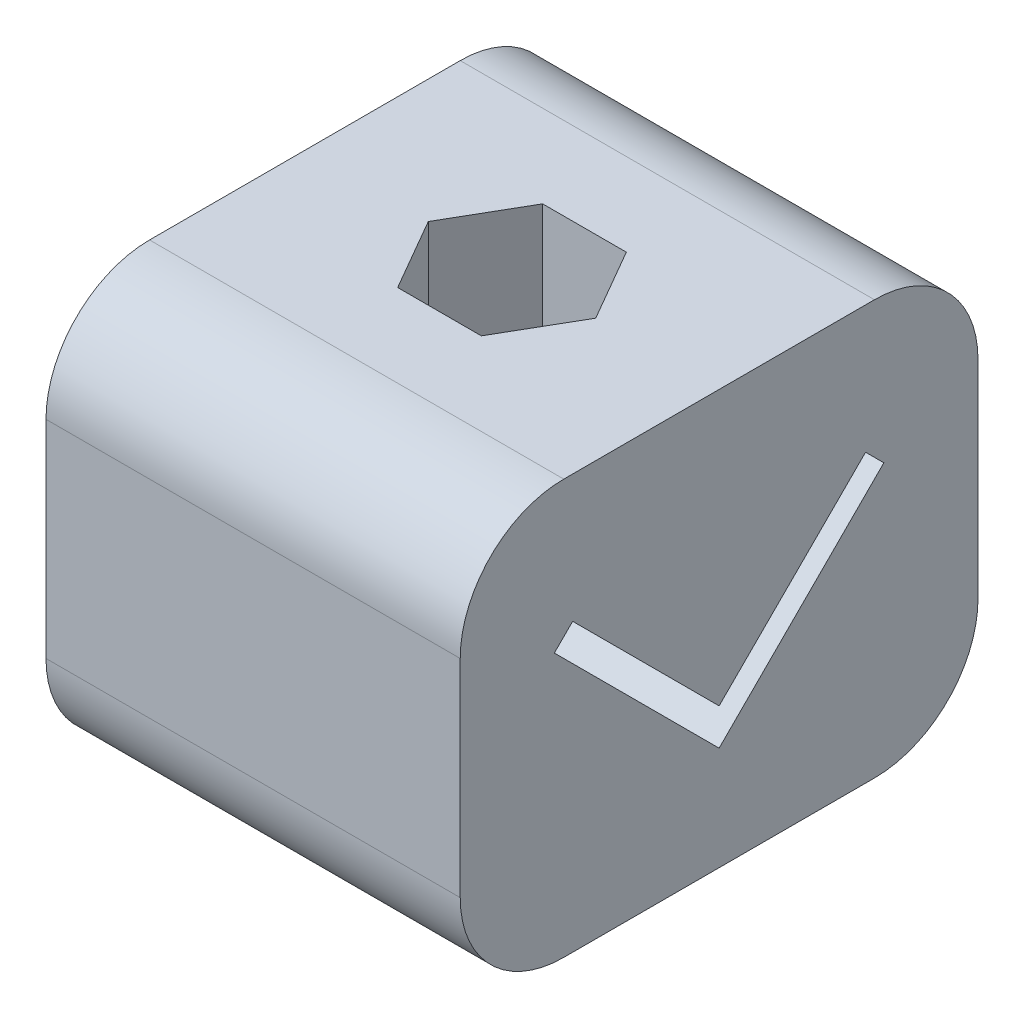
ISO-10303-21;
HEADER;
FILE_DESCRIPTION(('STEP AP214'),'2;1');
FILE_NAME('part.step','',(''),(''),'','','');
FILE_SCHEMA(('AUTOMOTIVE_DESIGN { 1 0 10303 214 1 1 1 1 }'));
ENDSEC;
DATA;
#1=APPLICATION_CONTEXT('core data for automotive mechanical design processes');
#2=APPLICATION_PROTOCOL_DEFINITION('international standard','automotive_design',2000,#1);
#3=PRODUCT_CONTEXT('',#1,'mechanical');
#4=PRODUCT('Part','Part','',(#3));
#5=PRODUCT_RELATED_PRODUCT_CATEGORY('part','',(#4));
#6=PRODUCT_DEFINITION_FORMATION('','',#4);
#7=PRODUCT_DEFINITION_CONTEXT('part definition',#1,'design');
#8=PRODUCT_DEFINITION('design','',#6,#7);
#9=PRODUCT_DEFINITION_SHAPE('','',#8);
#10=(LENGTH_UNIT() NAMED_UNIT(*) SI_UNIT(.MILLI.,.METRE.));
#11=(NAMED_UNIT(*) PLANE_ANGLE_UNIT() SI_UNIT($,.RADIAN.));
#12=(NAMED_UNIT(*) SI_UNIT($,.STERADIAN.) SOLID_ANGLE_UNIT());
#13=UNCERTAINTY_MEASURE_WITH_UNIT(LENGTH_MEASURE(1.E-05),#10,'distance_accuracy_value','');
#14=(GEOMETRIC_REPRESENTATION_CONTEXT(3) GLOBAL_UNCERTAINTY_ASSIGNED_CONTEXT((#13)) GLOBAL_UNIT_ASSIGNED_CONTEXT((#10,
#11,#12)) REPRESENTATION_CONTEXT('',''));
#15=CARTESIAN_POINT('',(0.,0.,0.));
#16=DIRECTION('',(0.,0.,1.));
#17=DIRECTION('',(1.,0.,0.));
#18=AXIS2_PLACEMENT_3D('',#15,#16,#17);
#19=CARTESIAN_POINT('',(0.,25.4,0.));
#20=DIRECTION('',(0.,1.,0.));
#21=DIRECTION('',(0.,0.,1.));
#22=AXIS2_PLACEMENT_3D('',#19,#20,#21);
#23=CYLINDRICAL_SURFACE('',#22,1.984375);
#24=CARTESIAN_POINT('',(0.,6.35,0.));
#25=DIRECTION('',(0.,-0.707106781186548,-0.707106781186547));
#26=DIRECTION('',(0.,0.707106781186547,-0.707106781186548));
#27=AXIS2_PLACEMENT_3D('',#24,#25,#26);
#28=ELLIPSE('',#27,2.8063300378341,1.984375);
#29=CARTESIAN_POINT('',(-1.98437499999993,6.35,0.));
#30=VERTEX_POINT('',#29);
#31=CARTESIAN_POINT('',(1.98437500000009,6.35,0.));
#32=VERTEX_POINT('',#31);
#33=EDGE_CURVE('E276',#30,#32,#28,.T.);
#34=ORIENTED_EDGE('',*,*,#33,.F.);
#35=CARTESIAN_POINT('',(0.,6.35,0.));
#36=DIRECTION('',(0.,-0.707106781186548,0.707106781186547));
#37=DIRECTION('',(0.,0.707106781186547,0.707106781186548));
#38=AXIS2_PLACEMENT_3D('',#35,#36,#37);
#39=ELLIPSE('',#38,2.8063300378341,1.984375);
#40=EDGE_CURVE('E280',#32,#30,#39,.T.);
#41=ORIENTED_EDGE('',*,*,#40,.F.);
#42=EDGE_LOOP('',(#34,#41));
#43=FACE_BOUND('',#42,.T.);
#44=CARTESIAN_POINT('',(0.,5.08,0.));
#45=DIRECTION('',(0.,-1.,0.));
#46=DIRECTION('',(0.,0.,-1.));
#47=AXIS2_PLACEMENT_3D('',#44,#45,#46);
#48=CIRCLE('',#47,1.984375);
#49=CARTESIAN_POINT('',(0.,5.08,-1.984375));
#50=VERTEX_POINT('',#49);
#51=EDGE_CURVE('E243',#50,#50,#48,.F.);
#52=ORIENTED_EDGE('',*,*,#51,.F.);
#53=EDGE_LOOP('',(#52));
#54=FACE_BOUND('',#53,.T.);
#55=ADVANCED_FACE('F39',(#43,#54),#23,.F.);
#56=CARTESIAN_POINT('',(0.,8.59506403026729,0.));
#57=DIRECTION('',(0.,0.707106781186548,0.707106781186548));
#58=DIRECTION('',(0.,0.707106781186548,-0.707106781186548));
#59=AXIS2_PLACEMENT_3D('',#56,#57,#58);
#60=ELLIPSE('',#59,2.80633003783411,1.984375);
#61=CARTESIAN_POINT('',(1.98437500000007,8.59506403026729,0.));
#62=VERTEX_POINT('',#61);
#63=CARTESIAN_POINT('',(-1.9843749999999,8.59506403026729,0.));
#64=VERTEX_POINT('',#63);
#65=EDGE_CURVE('E385',#62,#64,#60,.T.);
#66=ORIENTED_EDGE('',*,*,#65,.F.);
#67=CARTESIAN_POINT('',(0.,8.59506403026729,0.));
#68=DIRECTION('',(0.,0.707106781186548,-0.707106781186548));
#69=DIRECTION('',(0.,0.707106781186548,0.707106781186548));
#70=AXIS2_PLACEMENT_3D('',#67,#68,#69);
#71=ELLIPSE('',#70,2.80633003783411,1.984375);
#72=EDGE_CURVE('E272',#64,#62,#71,.T.);
#73=ORIENTED_EDGE('',*,*,#72,.F.);
#74=EDGE_LOOP('',(#66,#73));
#75=FACE_BOUND('',#74,.T.);
#76=CARTESIAN_POINT('',(0.,13.97,0.));
#77=DIRECTION('',(0.,1.,0.));
#78=DIRECTION('',(0.,0.,1.));
#79=AXIS2_PLACEMENT_3D('',#76,#77,#78);
#80=CIRCLE('',#79,1.984375);
#81=CARTESIAN_POINT('',(0.,13.97,1.984375));
#82=VERTEX_POINT('',#81);
#83=EDGE_CURVE('E260',#82,#82,#80,.F.);
#84=ORIENTED_EDGE('',*,*,#83,.F.);
#85=EDGE_LOOP('',(#84));
#86=FACE_BOUND('',#85,.T.);
#87=ADVANCED_FACE('F479',(#75,#86),#23,.F.);
#88=CARTESIAN_POINT('',(0.,0.,15.875));
#89=DIRECTION('',(0.,1.,0.));
#90=DIRECTION('',(0.,0.,1.));
#91=AXIS2_PLACEMENT_3D('',#88,#89,#90);
#92=PLANE('',#91);
#93=CARTESIAN_POINT('',(0.,0.,0.));
#94=DIRECTION('',(0.,-1.,0.));
#95=DIRECTION('',(0.,0.,-1.));
#96=AXIS2_PLACEMENT_3D('',#93,#94,#95);
#97=CIRCLE('',#96,4.1275);
#98=CARTESIAN_POINT('',(0.,0.,-4.1275));
#99=VERTEX_POINT('',#98);
#100=EDGE_CURVE('E226',#99,#99,#97,.T.);
#101=ORIENTED_EDGE('',*,*,#100,.F.);
#102=EDGE_LOOP('',(#101));
#103=FACE_BOUND('',#102,.T.);
#104=DIRECTION('',(0.,0.,-1.));
#105=VECTOR('',#104,1.);
#106=CARTESIAN_POINT('',(12.7,0.,15.875));
#107=LINE('',#106,#105);
#108=CARTESIAN_POINT('',(12.7,0.,9.525));
#109=VERTEX_POINT('',#108);
#110=CARTESIAN_POINT('',(12.7,0.,-9.525));
#111=VERTEX_POINT('',#110);
#112=EDGE_CURVE('E381',#109,#111,#107,.T.);
#113=ORIENTED_EDGE('',*,*,#112,.F.);
#114=DIRECTION('',(1.,0.,0.));
#115=VECTOR('',#114,1.);
#116=CARTESIAN_POINT('',(-12.7,0.,9.525));
#117=LINE('',#116,#115);
#118=CARTESIAN_POINT('',(-12.7,0.,9.525));
#119=VERTEX_POINT('',#118);
#120=EDGE_CURVE('E420',#109,#119,#117,.F.);
#121=ORIENTED_EDGE('',*,*,#120,.T.);
#122=DIRECTION('',(0.,0.,-1.));
#123=VECTOR('',#122,1.);
#124=CARTESIAN_POINT('',(-12.7,0.,15.875));
#125=LINE('',#124,#123);
#126=CARTESIAN_POINT('',(-12.7,0.,-9.525));
#127=VERTEX_POINT('',#126);
#128=EDGE_CURVE('E364',#119,#127,#125,.T.);
#129=ORIENTED_EDGE('',*,*,#128,.T.);
#130=DIRECTION('',(1.,0.,0.));
#131=VECTOR('',#130,1.);
#132=CARTESIAN_POINT('',(0.,0.,-9.525));
#133=LINE('',#132,#131);
#134=EDGE_CURVE('E416',#127,#111,#133,.T.);
#135=ORIENTED_EDGE('',*,*,#134,.T.);
#136=EDGE_LOOP('',(#113,#121,#129,#135));
#137=FACE_BOUND('',#136,.T.);
#138=ADVANCED_FACE('F461',(#103,#137),#92,.F.);
#139=CARTESIAN_POINT('',(12.7,0.,15.875));
#140=DIRECTION('',(-1.,0.,0.));
#141=DIRECTION('',(0.,-1.,0.));
#142=AXIS2_PLACEMENT_3D('',#139,#140,#141);
#143=PLANE('',#142);
#144=DIRECTION('',(0.,0.707106781186547,-0.707106781186548));
#145=VECTOR('',#144,1.);
#146=CARTESIAN_POINT('',(12.7,5.34028813620281,21.2152881362028));
#147=LINE('',#146,#145);
#148=CARTESIAN_POINT('',(12.7,16.4527881362028,10.1027881362028));
#149=VERTEX_POINT('',#148);
#150=CARTESIAN_POINT('',(12.7,17.5753201513364,8.98025612106915));
#151=VERTEX_POINT('',#150);
#152=EDGE_CURVE('E346',#149,#151,#147,.T.);
#153=ORIENTED_EDGE('',*,*,#152,.T.);
#154=DIRECTION('',(0.,-0.707106781186548,-0.707106781186548));
#155=VECTOR('',#154,1.);
#156=CARTESIAN_POINT('',(12.7,12.2350320151336,3.63996798486636));
#157=LINE('',#156,#155);
#158=CARTESIAN_POINT('',(12.7,8.59506403026729,0.));
#159=VERTEX_POINT('',#158);
#160=EDGE_CURVE('E350',#151,#159,#157,.T.);
#161=ORIENTED_EDGE('',*,*,#160,.T.);
#162=DIRECTION('',(0.,0.707106781186548,-0.707106781186548));
#163=VECTOR('',#162,1.);
#164=CARTESIAN_POINT('',(12.7,-3.63996798486636,12.2350320151336));
#165=LINE('',#164,#163);
#166=CARTESIAN_POINT('',(12.7,17.5753201513364,-8.98025612106915));
#167=VERTEX_POINT('',#166);
#168=EDGE_CURVE('E312',#159,#167,#165,.T.);
#169=ORIENTED_EDGE('',*,*,#168,.T.);
#170=DIRECTION('',(0.,-0.707106781186547,-0.707106781186548));
#171=VECTOR('',#170,1.);
#172=CARTESIAN_POINT('',(12.7,21.2152881362028,-5.34028813620277));
#173=LINE('',#172,#171);
#174=CARTESIAN_POINT('',(12.7,16.4527881362028,-10.1027881362028));
#175=VERTEX_POINT('',#174);
#176=EDGE_CURVE('E334',#167,#175,#173,.T.);
#177=ORIENTED_EDGE('',*,*,#176,.T.);
#178=DIRECTION('',(0.,-0.707106781186547,0.707106781186548));
#179=VECTOR('',#178,1.);
#180=CARTESIAN_POINT('',(12.7,-4.7625,11.1125));
#181=LINE('',#180,#179);
#182=CARTESIAN_POINT('',(12.7,6.35,0.));
#183=VERTEX_POINT('',#182);
#184=EDGE_CURVE('E338',#175,#183,#181,.T.);
#185=ORIENTED_EDGE('',*,*,#184,.T.);
#186=DIRECTION('',(0.,0.707106781186547,0.707106781186548));
#187=VECTOR('',#186,1.);
#188=CARTESIAN_POINT('',(12.7,11.1125,4.7625));
#189=LINE('',#188,#187);
#190=EDGE_CURVE('E342',#183,#149,#189,.T.);
#191=ORIENTED_EDGE('',*,*,#190,.T.);
#192=EDGE_LOOP('',(#153,#161,#169,#177,#185,#191));
#193=FACE_BOUND('',#192,.T.);
#194=DIRECTION('',(0.,1.,0.));
#195=VECTOR('',#194,1.);
#196=CARTESIAN_POINT('',(12.7,0.,15.875));
#197=LINE('',#196,#195);
#198=CARTESIAN_POINT('',(12.7,6.35,15.875));
#199=VERTEX_POINT('',#198);
#200=CARTESIAN_POINT('',(12.7,19.05,15.875));
#201=VERTEX_POINT('',#200);
#202=EDGE_CURVE('E355',#199,#201,#197,.T.);
#203=ORIENTED_EDGE('',*,*,#202,.F.);
#204=CARTESIAN_POINT('',(12.7,6.35,9.525));
#205=DIRECTION('',(-1.,0.,0.));
#206=DIRECTION('',(0.,-1.,0.));
#207=AXIS2_PLACEMENT_3D('',#204,#205,#206);
#208=CIRCLE('',#207,6.35);
#209=EDGE_CURVE('E413',#199,#109,#208,.F.);
#210=ORIENTED_EDGE('',*,*,#209,.T.);
#211=ORIENTED_EDGE('',*,*,#112,.T.);
#212=CARTESIAN_POINT('',(12.7,6.35,-9.525));
#213=DIRECTION('',(-1.,0.,0.));
#214=DIRECTION('',(0.,-1.,0.));
#215=AXIS2_PLACEMENT_3D('',#212,#213,#214);
#216=CIRCLE('',#215,6.35);
#217=CARTESIAN_POINT('',(12.7,6.35,-15.875));
#218=VERTEX_POINT('',#217);
#219=EDGE_CURVE('E410',#111,#218,#216,.F.);
#220=ORIENTED_EDGE('',*,*,#219,.T.);
#221=DIRECTION('',(0.,1.,0.));
#222=VECTOR('',#221,1.);
#223=CARTESIAN_POINT('',(12.7,0.,-15.875));
#224=LINE('',#223,#222);
#225=CARTESIAN_POINT('',(12.7,19.05,-15.875));
#226=VERTEX_POINT('',#225);
#227=EDGE_CURVE('E354',#218,#226,#224,.T.);
#228=ORIENTED_EDGE('',*,*,#227,.T.);
#229=CARTESIAN_POINT('',(12.7,19.05,-9.525));
#230=DIRECTION('',(-1.,0.,0.));
#231=DIRECTION('',(0.,-1.,0.));
#232=AXIS2_PLACEMENT_3D('',#229,#230,#231);
#233=CIRCLE('',#232,6.35);
#234=CARTESIAN_POINT('',(12.7,25.4,-9.525));
#235=VERTEX_POINT('',#234);
#236=EDGE_CURVE('E407',#226,#235,#233,.F.);
#237=ORIENTED_EDGE('',*,*,#236,.T.);
#238=DIRECTION('',(0.,0.,-1.));
#239=VECTOR('',#238,1.);
#240=CARTESIAN_POINT('',(12.7,25.4,15.875));
#241=LINE('',#240,#239);
#242=CARTESIAN_POINT('',(12.7,25.4,9.525));
#243=VERTEX_POINT('',#242);
#244=EDGE_CURVE('E377',#243,#235,#241,.T.);
#245=ORIENTED_EDGE('',*,*,#244,.F.);
#246=CARTESIAN_POINT('',(12.7,19.05,9.525));
#247=DIRECTION('',(-1.,0.,0.));
#248=DIRECTION('',(0.,-1.,0.));
#249=AXIS2_PLACEMENT_3D('',#246,#247,#248);
#250=CIRCLE('',#249,6.35);
#251=EDGE_CURVE('E404',#243,#201,#250,.F.);
#252=ORIENTED_EDGE('',*,*,#251,.T.);
#253=EDGE_LOOP('',(#203,#210,#211,#220,#228,#237,#245,#252));
#254=FACE_BOUND('',#253,.T.);
#255=ADVANCED_FACE('F447',(#193,#254),#143,.F.);
#256=CARTESIAN_POINT('',(12.7,25.4,15.875));
#257=DIRECTION('',(0.,-1.,0.));
#258=DIRECTION('',(1.,0.,0.));
#259=AXIS2_PLACEMENT_3D('',#256,#257,#258);
#260=PLANE('',#259);
#261=DIRECTION('',(-0.5,0.,-0.866025403784439));
#262=VECTOR('',#261,1.);
#263=CARTESIAN_POINT('',(5.13264389309577,25.4,0.));
#264=LINE('',#263,#262);
#265=CARTESIAN_POINT('',(5.13264389309577,25.4,0.));
#266=VERTEX_POINT('',#265);
#267=CARTESIAN_POINT('',(2.56632194654788,25.4,-4.445));
#268=VERTEX_POINT('',#267);
#269=EDGE_CURVE('E242',#266,#268,#264,.T.);
#270=ORIENTED_EDGE('',*,*,#269,.F.);
#271=DIRECTION('',(0.5,0.,-0.866025403784439));
#272=VECTOR('',#271,1.);
#273=CARTESIAN_POINT('',(2.56632194654788,25.4,4.445));
#274=LINE('',#273,#272);
#275=CARTESIAN_POINT('',(2.56632194654788,25.4,4.445));
#276=VERTEX_POINT('',#275);
#277=EDGE_CURVE('E197',#276,#266,#274,.T.);
#278=ORIENTED_EDGE('',*,*,#277,.F.);
#279=DIRECTION('',(1.,0.,0.));
#280=VECTOR('',#279,1.);
#281=CARTESIAN_POINT('',(-2.56632194654789,25.4,4.445));
#282=LINE('',#281,#280);
#283=CARTESIAN_POINT('',(-2.56632194654789,25.4,4.445));
#284=VERTEX_POINT('',#283);
#285=EDGE_CURVE('E219',#284,#276,#282,.T.);
#286=ORIENTED_EDGE('',*,*,#285,.F.);
#287=DIRECTION('',(0.5,0.,0.866025403784439));
#288=VECTOR('',#287,1.);
#289=CARTESIAN_POINT('',(-5.13264389309578,25.4,0.));
#290=LINE('',#289,#288);
#291=CARTESIAN_POINT('',(-5.13264389309578,25.4,0.));
#292=VERTEX_POINT('',#291);
#293=EDGE_CURVE('E223',#292,#284,#290,.T.);
#294=ORIENTED_EDGE('',*,*,#293,.F.);
#295=DIRECTION('',(-0.5,0.,0.866025403784439));
#296=VECTOR('',#295,1.);
#297=CARTESIAN_POINT('',(-2.56632194654789,25.4,-4.445));
#298=LINE('',#297,#296);
#299=CARTESIAN_POINT('',(-2.56632194654789,25.4,-4.445));
#300=VERTEX_POINT('',#299);
#301=EDGE_CURVE('E250',#300,#292,#298,.T.);
#302=ORIENTED_EDGE('',*,*,#301,.F.);
#303=DIRECTION('',(-1.,0.,0.));
#304=VECTOR('',#303,1.);
#305=CARTESIAN_POINT('',(2.56632194654788,25.4,-4.445));
#306=LINE('',#305,#304);
#307=EDGE_CURVE('E246',#268,#300,#306,.T.);
#308=ORIENTED_EDGE('',*,*,#307,.F.);
#309=EDGE_LOOP('',(#270,#278,#286,#294,#302,#308));
#310=FACE_BOUND('',#309,.T.);
#311=ORIENTED_EDGE('',*,*,#244,.T.);
#312=DIRECTION('',(-1.,0.,0.));
#313=VECTOR('',#312,1.);
#314=CARTESIAN_POINT('',(12.7,25.4,-9.525));
#315=LINE('',#314,#313);
#316=CARTESIAN_POINT('',(-12.7,25.4,-9.525));
#317=VERTEX_POINT('',#316);
#318=EDGE_CURVE('E11',#235,#317,#315,.T.);
#319=ORIENTED_EDGE('',*,*,#318,.T.);
#320=DIRECTION('',(0.,0.,-1.));
#321=VECTOR('',#320,1.);
#322=CARTESIAN_POINT('',(-12.7,25.4,15.875));
#323=LINE('',#322,#321);
#324=CARTESIAN_POINT('',(-12.7,25.4,9.525));
#325=VERTEX_POINT('',#324);
#326=EDGE_CURVE('E374',#325,#317,#323,.T.);
#327=ORIENTED_EDGE('',*,*,#326,.F.);
#328=DIRECTION('',(-1.,0.,0.));
#329=VECTOR('',#328,1.);
#330=CARTESIAN_POINT('',(12.7,25.4,9.525));
#331=LINE('',#330,#329);
#332=EDGE_CURVE('E48',#325,#243,#331,.F.);
#333=ORIENTED_EDGE('',*,*,#332,.T.);
#334=EDGE_LOOP('',(#311,#319,#327,#333));
#335=FACE_BOUND('',#334,.T.);
#336=ADVANCED_FACE('F442',(#310,#335),#260,.F.);
#337=CARTESIAN_POINT('',(-12.7,25.4,15.875));
#338=DIRECTION('',(1.,0.,0.));
#339=DIRECTION('',(0.,0.,-1.));
#340=AXIS2_PLACEMENT_3D('',#337,#338,#339);
#341=PLANE('',#340);
#342=DIRECTION('',(0.,0.707106781186548,-0.707106781186548));
#343=VECTOR('',#342,1.);
#344=CARTESIAN_POINT('',(-12.7,8.59506403026729,0.));
#345=LINE('',#344,#343);
#346=CARTESIAN_POINT('',(-12.7,8.59506403026729,0.));
#347=VERTEX_POINT('',#346);
#348=CARTESIAN_POINT('',(-12.7,17.5753201513364,-8.98025612106915));
#349=VERTEX_POINT('',#348);
#350=EDGE_CURVE('E288',#347,#349,#345,.T.);
#351=ORIENTED_EDGE('',*,*,#350,.F.);
#352=DIRECTION('',(0.,-0.707106781186548,-0.707106781186548));
#353=VECTOR('',#352,1.);
#354=CARTESIAN_POINT('',(-12.7,17.5753201513364,8.98025612106915));
#355=LINE('',#354,#353);
#356=CARTESIAN_POINT('',(-12.7,17.5753201513364,8.98025612106915));
#357=VERTEX_POINT('',#356);
#358=EDGE_CURVE('E284',#357,#347,#355,.T.);
#359=ORIENTED_EDGE('',*,*,#358,.F.);
#360=DIRECTION('',(0.,0.707106781186547,-0.707106781186548));
#361=VECTOR('',#360,1.);
#362=CARTESIAN_POINT('',(-12.7,16.4527881362028,10.1027881362028));
#363=LINE('',#362,#361);
#364=CARTESIAN_POINT('',(-12.7,16.4527881362028,10.1027881362028));
#365=VERTEX_POINT('',#364);
#366=EDGE_CURVE('E304',#365,#357,#363,.T.);
#367=ORIENTED_EDGE('',*,*,#366,.F.);
#368=DIRECTION('',(0.,0.707106781186547,0.707106781186547));
#369=VECTOR('',#368,1.);
#370=CARTESIAN_POINT('',(-12.7,6.35,0.));
#371=LINE('',#370,#369);
#372=CARTESIAN_POINT('',(-12.7,6.35,0.));
#373=VERTEX_POINT('',#372);
#374=EDGE_CURVE('E300',#373,#365,#371,.T.);
#375=ORIENTED_EDGE('',*,*,#374,.F.);
#376=DIRECTION('',(0.,-0.707106781186547,0.707106781186547));
#377=VECTOR('',#376,1.);
#378=CARTESIAN_POINT('',(-12.7,16.4527881362028,-10.1027881362028));
#379=LINE('',#378,#377);
#380=CARTESIAN_POINT('',(-12.7,16.4527881362028,-10.1027881362028));
#381=VERTEX_POINT('',#380);
#382=EDGE_CURVE('E296',#381,#373,#379,.T.);
#383=ORIENTED_EDGE('',*,*,#382,.F.);
#384=DIRECTION('',(0.,-0.707106781186547,-0.707106781186548));
#385=VECTOR('',#384,1.);
#386=CARTESIAN_POINT('',(-12.7,17.5753201513364,-8.98025612106915));
#387=LINE('',#386,#385);
#388=EDGE_CURVE('E292',#349,#381,#387,.T.);
#389=ORIENTED_EDGE('',*,*,#388,.F.);
#390=EDGE_LOOP('',(#351,#359,#367,#375,#383,#389));
#391=FACE_BOUND('',#390,.T.);
#392=ORIENTED_EDGE('',*,*,#128,.F.);
#393=CARTESIAN_POINT('',(-12.7,6.35,9.525));
#394=DIRECTION('',(1.,0.,0.));
#395=DIRECTION('',(0.,0.,-1.));
#396=AXIS2_PLACEMENT_3D('',#393,#394,#395);
#397=CIRCLE('',#396,6.35);
#398=CARTESIAN_POINT('',(-12.7,6.35,15.875));
#399=VERTEX_POINT('',#398);
#400=EDGE_CURVE('E430',#119,#399,#397,.F.);
#401=ORIENTED_EDGE('',*,*,#400,.T.);
#402=DIRECTION('',(0.,-1.,0.));
#403=VECTOR('',#402,1.);
#404=CARTESIAN_POINT('',(-12.7,25.4,15.875));
#405=LINE('',#404,#403);
#406=CARTESIAN_POINT('',(-12.7,19.05,15.875));
#407=VERTEX_POINT('',#406);
#408=EDGE_CURVE('E359',#407,#399,#405,.T.);
#409=ORIENTED_EDGE('',*,*,#408,.F.);
#410=CARTESIAN_POINT('',(-12.7,19.05,9.525));
#411=DIRECTION('',(1.,0.,0.));
#412=DIRECTION('',(0.,0.,-1.));
#413=AXIS2_PLACEMENT_3D('',#410,#411,#412);
#414=CIRCLE('',#413,6.35);
#415=EDGE_CURVE('E62',#407,#325,#414,.F.);
#416=ORIENTED_EDGE('',*,*,#415,.T.);
#417=ORIENTED_EDGE('',*,*,#326,.T.);
#418=CARTESIAN_POINT('',(-12.7,19.05,-9.525));
#419=DIRECTION('',(1.,0.,0.));
#420=DIRECTION('',(0.,0.,-1.));
#421=AXIS2_PLACEMENT_3D('',#418,#419,#420);
#422=CIRCLE('',#421,6.35);
#423=CARTESIAN_POINT('',(-12.7,19.05,-15.875));
#424=VERTEX_POINT('',#423);
#425=EDGE_CURVE('E55',#317,#424,#422,.F.);
#426=ORIENTED_EDGE('',*,*,#425,.T.);
#427=DIRECTION('',(0.,-1.,0.));
#428=VECTOR('',#427,1.);
#429=CARTESIAN_POINT('',(-12.7,25.4,-15.875));
#430=LINE('',#429,#428);
#431=CARTESIAN_POINT('',(-12.7,6.35,-15.875));
#432=VERTEX_POINT('',#431);
#433=EDGE_CURVE('E360',#424,#432,#430,.T.);
#434=ORIENTED_EDGE('',*,*,#433,.T.);
#435=CARTESIAN_POINT('',(-12.7,6.35,-9.525));
#436=DIRECTION('',(1.,0.,0.));
#437=DIRECTION('',(0.,0.,-1.));
#438=AXIS2_PLACEMENT_3D('',#435,#436,#437);
#439=CIRCLE('',#438,6.35);
#440=EDGE_CURVE('E427',#432,#127,#439,.F.);
#441=ORIENTED_EDGE('',*,*,#440,.T.);
#442=EDGE_LOOP('',(#392,#401,#409,#416,#417,#426,#434,#441));
#443=FACE_BOUND('',#442,.T.);
#444=ADVANCED_FACE('F454',(#391,#443),#341,.F.);
#445=CARTESIAN_POINT('',(0.,0.,15.875));
#446=DIRECTION('',(0.,0.,1.));
#447=DIRECTION('',(1.,0.,0.));
#448=AXIS2_PLACEMENT_3D('',#445,#446,#447);
#449=PLANE('',#448);
#450=ORIENTED_EDGE('',*,*,#408,.T.);
#451=DIRECTION('',(1.,0.,0.));
#452=VECTOR('',#451,1.);
#453=CARTESIAN_POINT('',(12.7,6.35,15.875));
#454=LINE('',#453,#452);
#455=EDGE_CURVE('E400',#399,#199,#454,.T.);
#456=ORIENTED_EDGE('',*,*,#455,.T.);
#457=ORIENTED_EDGE('',*,*,#202,.T.);
#458=DIRECTION('',(-1.,0.,0.));
#459=VECTOR('',#458,1.);
#460=CARTESIAN_POINT('',(-12.7,19.05,15.875));
#461=LINE('',#460,#459);
#462=EDGE_CURVE('E389',#201,#407,#461,.T.);
#463=ORIENTED_EDGE('',*,*,#462,.T.);
#464=EDGE_LOOP('',(#450,#456,#457,#463));
#465=FACE_BOUND('',#464,.T.);
#466=ADVANCED_FACE('F451',(#465),#449,.T.);
#467=CARTESIAN_POINT('',(0.,0.,-15.875));
#468=DIRECTION('',(0.,0.,1.));
#469=DIRECTION('',(1.,0.,0.));
#470=AXIS2_PLACEMENT_3D('',#467,#468,#469);
#471=PLANE('',#470);
#472=ORIENTED_EDGE('',*,*,#227,.F.);
#473=DIRECTION('',(1.,0.,0.));
#474=VECTOR('',#473,1.);
#475=CARTESIAN_POINT('',(0.,6.35,-15.875));
#476=LINE('',#475,#474);
#477=EDGE_CURVE('E436',#218,#432,#476,.F.);
#478=ORIENTED_EDGE('',*,*,#477,.T.);
#479=ORIENTED_EDGE('',*,*,#433,.F.);
#480=DIRECTION('',(-1.,0.,0.));
#481=VECTOR('',#480,1.);
#482=CARTESIAN_POINT('',(0.,19.05,-15.875));
#483=LINE('',#482,#481);
#484=EDGE_CURVE('E433',#424,#226,#483,.F.);
#485=ORIENTED_EDGE('',*,*,#484,.T.);
#486=EDGE_LOOP('',(#472,#478,#479,#485));
#487=FACE_BOUND('',#486,.T.);
#488=ADVANCED_FACE('F469',(#487),#471,.F.);
#489=CARTESIAN_POINT('',(139.7,17.5753201513364,8.98025612106915));
#490=DIRECTION('',(0.,0.707106781186548,-0.707106781186548));
#491=DIRECTION('',(0.,0.707106781186548,0.707106781186548));
#492=AXIS2_PLACEMENT_3D('',#489,#490,#491);
#493=PLANE('',#492);
#494=DIRECTION('',(-1.,0.,0.));
#495=VECTOR('',#494,1.);
#496=CARTESIAN_POINT('',(139.7,8.59506403026729,0.));
#497=LINE('',#496,#495);
#498=EDGE_CURVE('E308',#64,#347,#497,.T.);
#499=ORIENTED_EDGE('',*,*,#498,.F.);
#500=ORIENTED_EDGE('',*,*,#72,.T.);
#501=EDGE_CURVE('E327',#159,#62,#497,.T.);
#502=ORIENTED_EDGE('',*,*,#501,.F.);
#503=ORIENTED_EDGE('',*,*,#160,.F.);
#504=DIRECTION('',(-1.,0.,0.));
#505=VECTOR('',#504,1.);
#506=CARTESIAN_POINT('',(139.7,17.5753201513364,8.98025612106915));
#507=LINE('',#506,#505);
#508=EDGE_CURVE('E309',#151,#357,#507,.T.);
#509=ORIENTED_EDGE('',*,*,#508,.T.);
#510=ORIENTED_EDGE('',*,*,#358,.T.);
#511=EDGE_LOOP('',(#499,#500,#502,#503,#509,#510));
#512=FACE_BOUND('',#511,.T.);
#513=ADVANCED_FACE('F494',(#512),#493,.F.);
#514=CARTESIAN_POINT('',(139.7,16.4527881362028,10.1027881362028));
#515=DIRECTION('',(0.,0.707106781186548,0.707106781186547));
#516=DIRECTION('',(0.,-0.707106781186547,0.707106781186548));
#517=AXIS2_PLACEMENT_3D('',#514,#515,#516);
#518=PLANE('',#517);
#519=DIRECTION('',(-1.,0.,0.));
#520=VECTOR('',#519,1.);
#521=CARTESIAN_POINT('',(139.7,16.4527881362028,10.1027881362028));
#522=LINE('',#521,#520);
#523=EDGE_CURVE('E313',#149,#365,#522,.T.);
#524=ORIENTED_EDGE('',*,*,#523,.T.);
#525=ORIENTED_EDGE('',*,*,#366,.T.);
#526=ORIENTED_EDGE('',*,*,#508,.F.);
#527=ORIENTED_EDGE('',*,*,#152,.F.);
#528=EDGE_LOOP('',(#524,#525,#526,#527));
#529=FACE_BOUND('',#528,.T.);
#530=ADVANCED_FACE('F490',(#529),#518,.F.);
#531=CARTESIAN_POINT('',(139.7,6.35,0.));
#532=DIRECTION('',(0.,-0.707106781186548,0.707106781186547));
#533=DIRECTION('',(0.,-0.707106781186547,-0.707106781186548));
#534=AXIS2_PLACEMENT_3D('',#531,#532,#533);
#535=PLANE('',#534);
#536=DIRECTION('',(-1.,0.,0.));
#537=VECTOR('',#536,1.);
#538=CARTESIAN_POINT('',(139.7,6.35,0.));
#539=LINE('',#538,#537);
#540=EDGE_CURVE('E316',#183,#32,#539,.T.);
#541=ORIENTED_EDGE('',*,*,#540,.T.);
#542=ORIENTED_EDGE('',*,*,#40,.T.);
#543=EDGE_CURVE('E320',#30,#373,#539,.T.);
#544=ORIENTED_EDGE('',*,*,#543,.T.);
#545=ORIENTED_EDGE('',*,*,#374,.T.);
#546=ORIENTED_EDGE('',*,*,#523,.F.);
#547=ORIENTED_EDGE('',*,*,#190,.F.);
#548=EDGE_LOOP('',(#541,#542,#544,#545,#546,#547));
#549=FACE_BOUND('',#548,.T.);
#550=ADVANCED_FACE('F493',(#549),#535,.F.);
#551=CARTESIAN_POINT('',(139.7,16.4527881362028,-10.1027881362028));
#552=DIRECTION('',(0.,-0.707106781186548,-0.707106781186547));
#553=DIRECTION('',(0.,0.707106781186547,-0.707106781186548));
#554=AXIS2_PLACEMENT_3D('',#551,#552,#553);
#555=PLANE('',#554);
#556=ORIENTED_EDGE('',*,*,#543,.F.);
#557=ORIENTED_EDGE('',*,*,#33,.T.);
#558=ORIENTED_EDGE('',*,*,#540,.F.);
#559=ORIENTED_EDGE('',*,*,#184,.F.);
#560=DIRECTION('',(-1.,0.,0.));
#561=VECTOR('',#560,1.);
#562=CARTESIAN_POINT('',(139.7,16.4527881362028,-10.1027881362028));
#563=LINE('',#562,#561);
#564=EDGE_CURVE('E321',#175,#381,#563,.T.);
#565=ORIENTED_EDGE('',*,*,#564,.T.);
#566=ORIENTED_EDGE('',*,*,#382,.T.);
#567=EDGE_LOOP('',(#556,#557,#558,#559,#565,#566));
#568=FACE_BOUND('',#567,.T.);
#569=ADVANCED_FACE('F498',(#568),#555,.F.);
#570=CARTESIAN_POINT('',(139.7,17.5753201513364,-8.98025612106915));
#571=DIRECTION('',(0.,0.707106781186548,-0.707106781186547));
#572=DIRECTION('',(0.,0.707106781186547,0.707106781186548));
#573=AXIS2_PLACEMENT_3D('',#570,#571,#572);
#574=PLANE('',#573);
#575=DIRECTION('',(-1.,0.,0.));
#576=VECTOR('',#575,1.);
#577=CARTESIAN_POINT('',(139.7,17.5753201513364,-8.98025612106915));
#578=LINE('',#577,#576);
#579=EDGE_CURVE('E324',#167,#349,#578,.T.);
#580=ORIENTED_EDGE('',*,*,#579,.T.);
#581=ORIENTED_EDGE('',*,*,#388,.T.);
#582=ORIENTED_EDGE('',*,*,#564,.F.);
#583=ORIENTED_EDGE('',*,*,#176,.F.);
#584=EDGE_LOOP('',(#580,#581,#582,#583));
#585=FACE_BOUND('',#584,.T.);
#586=ADVANCED_FACE('F502',(#585),#574,.F.);
#587=CARTESIAN_POINT('',(139.7,8.59506403026729,0.));
#588=DIRECTION('',(0.,0.707106781186548,0.707106781186548));
#589=DIRECTION('',(0.,-0.707106781186548,0.707106781186548));
#590=AXIS2_PLACEMENT_3D('',#587,#588,#589);
#591=PLANE('',#590);
#592=ORIENTED_EDGE('',*,*,#501,.T.);
#593=ORIENTED_EDGE('',*,*,#65,.T.);
#594=ORIENTED_EDGE('',*,*,#498,.T.);
#595=ORIENTED_EDGE('',*,*,#350,.T.);
#596=ORIENTED_EDGE('',*,*,#579,.F.);
#597=ORIENTED_EDGE('',*,*,#168,.F.);
#598=EDGE_LOOP('',(#592,#593,#594,#595,#596,#597));
#599=FACE_BOUND('',#598,.T.);
#600=ADVANCED_FACE('F506',(#599),#591,.F.);
#601=CARTESIAN_POINT('',(0.,13.97,0.));
#602=DIRECTION('',(0.,1.,0.));
#603=DIRECTION('',(0.,0.,1.));
#604=AXIS2_PLACEMENT_3D('',#601,#602,#603);
#605=PLANE('',#604);
#606=DIRECTION('',(0.5,0.,-0.866025403784439));
#607=VECTOR('',#606,1.);
#608=CARTESIAN_POINT('',(2.56632194654788,13.97,4.445));
#609=LINE('',#608,#607);
#610=CARTESIAN_POINT('',(2.56632194654788,13.97,4.445));
#611=VERTEX_POINT('',#610);
#612=CARTESIAN_POINT('',(5.13264389309577,13.97,0.));
#613=VERTEX_POINT('',#612);
#614=EDGE_CURVE('E194',#611,#613,#609,.T.);
#615=ORIENTED_EDGE('',*,*,#614,.T.);
#616=DIRECTION('',(-0.5,0.,-0.866025403784439));
#617=VECTOR('',#616,1.);
#618=CARTESIAN_POINT('',(5.13264389309577,13.97,0.));
#619=LINE('',#618,#617);
#620=CARTESIAN_POINT('',(2.56632194654788,13.97,-4.445));
#621=VERTEX_POINT('',#620);
#622=EDGE_CURVE('E206',#613,#621,#619,.T.);
#623=ORIENTED_EDGE('',*,*,#622,.T.);
#624=DIRECTION('',(-1.,0.,0.));
#625=VECTOR('',#624,1.);
#626=CARTESIAN_POINT('',(2.56632194654788,13.97,-4.445));
#627=LINE('',#626,#625);
#628=CARTESIAN_POINT('',(-2.56632194654789,13.97,-4.445));
#629=VERTEX_POINT('',#628);
#630=EDGE_CURVE('E212',#621,#629,#627,.T.);
#631=ORIENTED_EDGE('',*,*,#630,.T.);
#632=DIRECTION('',(-0.5,0.,0.866025403784439));
#633=VECTOR('',#632,1.);
#634=CARTESIAN_POINT('',(-2.56632194654789,13.97,-4.445));
#635=LINE('',#634,#633);
#636=CARTESIAN_POINT('',(-5.13264389309577,13.97,0.));
#637=VERTEX_POINT('',#636);
#638=EDGE_CURVE('E231',#629,#637,#635,.T.);
#639=ORIENTED_EDGE('',*,*,#638,.T.);
#640=DIRECTION('',(0.5,0.,0.866025403784439));
#641=VECTOR('',#640,1.);
#642=CARTESIAN_POINT('',(-5.13264389309577,13.97,0.));
#643=LINE('',#642,#641);
#644=CARTESIAN_POINT('',(-2.56632194654789,13.97,4.445));
#645=VERTEX_POINT('',#644);
#646=EDGE_CURVE('E235',#637,#645,#643,.T.);
#647=ORIENTED_EDGE('',*,*,#646,.T.);
#648=DIRECTION('',(1.,0.,0.));
#649=VECTOR('',#648,1.);
#650=CARTESIAN_POINT('',(-2.56632194654789,13.97,4.445));
#651=LINE('',#650,#649);
#652=EDGE_CURVE('E203',#645,#611,#651,.T.);
#653=ORIENTED_EDGE('',*,*,#652,.T.);
#654=EDGE_LOOP('',(#615,#623,#631,#639,#647,#653));
#655=FACE_BOUND('',#654,.T.);
#656=ORIENTED_EDGE('',*,*,#83,.T.);
#657=EDGE_LOOP('',(#656));
#658=FACE_BOUND('',#657,.T.);
#659=ADVANCED_FACE('F214',(#655,#658),#605,.T.);
#660=CARTESIAN_POINT('',(2.56632194654788,13.97,4.445));
#661=DIRECTION('',(0.866025403784439,0.,0.5));
#662=DIRECTION('',(0.5,0.,-0.866025403784439));
#663=AXIS2_PLACEMENT_3D('',#660,#661,#662);
#664=PLANE('',#663);
#665=ORIENTED_EDGE('',*,*,#277,.T.);
#666=DIRECTION('',(0.,1.,0.));
#667=VECTOR('',#666,1.);
#668=CARTESIAN_POINT('',(5.13264389309577,13.97,0.));
#669=LINE('',#668,#667);
#670=EDGE_CURVE('E190',#613,#266,#669,.T.);
#671=ORIENTED_EDGE('',*,*,#670,.F.);
#672=ORIENTED_EDGE('',*,*,#614,.F.);
#673=DIRECTION('',(0.,1.,0.));
#674=VECTOR('',#673,1.);
#675=CARTESIAN_POINT('',(2.56632194654788,13.97,4.445));
#676=LINE('',#675,#674);
#677=EDGE_CURVE('E257',#611,#276,#676,.T.);
#678=ORIENTED_EDGE('',*,*,#677,.T.);
#679=EDGE_LOOP('',(#665,#671,#672,#678));
#680=FACE_BOUND('',#679,.T.);
#681=ADVANCED_FACE('F192',(#680),#664,.F.);
#682=CARTESIAN_POINT('',(-2.56632194654789,13.97,4.445));
#683=DIRECTION('',(0.,0.,1.));
#684=DIRECTION('',(1.,0.,0.));
#685=AXIS2_PLACEMENT_3D('',#682,#683,#684);
#686=PLANE('',#685);
#687=ORIENTED_EDGE('',*,*,#285,.T.);
#688=ORIENTED_EDGE('',*,*,#677,.F.);
#689=ORIENTED_EDGE('',*,*,#652,.F.);
#690=DIRECTION('',(0.,1.,0.));
#691=VECTOR('',#690,1.);
#692=CARTESIAN_POINT('',(-2.56632194654789,13.97,4.445));
#693=LINE('',#692,#691);
#694=EDGE_CURVE('E261',#645,#284,#693,.T.);
#695=ORIENTED_EDGE('',*,*,#694,.T.);
#696=EDGE_LOOP('',(#687,#688,#689,#695));
#697=FACE_BOUND('',#696,.T.);
#698=ADVANCED_FACE('F548',(#697),#686,.F.);
#699=CARTESIAN_POINT('',(-5.13264389309577,13.97,0.));
#700=DIRECTION('',(-0.866025403784439,0.,0.5));
#701=DIRECTION('',(0.5,0.,0.866025403784439));
#702=AXIS2_PLACEMENT_3D('',#699,#700,#701);
#703=PLANE('',#702);
#704=ORIENTED_EDGE('',*,*,#293,.T.);
#705=ORIENTED_EDGE('',*,*,#694,.F.);
#706=ORIENTED_EDGE('',*,*,#646,.F.);
#707=DIRECTION('',(0.,1.,0.));
#708=VECTOR('',#707,1.);
#709=CARTESIAN_POINT('',(-5.13264389309577,13.97,0.));
#710=LINE('',#709,#708);
#711=EDGE_CURVE('E264',#637,#292,#710,.T.);
#712=ORIENTED_EDGE('',*,*,#711,.T.);
#713=EDGE_LOOP('',(#704,#705,#706,#712));
#714=FACE_BOUND('',#713,.T.);
#715=ADVANCED_FACE('F551',(#714),#703,.F.);
#716=CARTESIAN_POINT('',(-2.56632194654789,13.97,-4.445));
#717=DIRECTION('',(-0.866025403784439,0.,-0.5));
#718=DIRECTION('',(-0.5,0.,0.866025403784439));
#719=AXIS2_PLACEMENT_3D('',#716,#717,#718);
#720=PLANE('',#719);
#721=ORIENTED_EDGE('',*,*,#301,.T.);
#722=ORIENTED_EDGE('',*,*,#711,.F.);
#723=ORIENTED_EDGE('',*,*,#638,.F.);
#724=DIRECTION('',(0.,1.,0.));
#725=VECTOR('',#724,1.);
#726=CARTESIAN_POINT('',(-2.56632194654789,13.97,-4.445));
#727=LINE('',#726,#725);
#728=EDGE_CURVE('E267',#629,#300,#727,.T.);
#729=ORIENTED_EDGE('',*,*,#728,.T.);
#730=EDGE_LOOP('',(#721,#722,#723,#729));
#731=FACE_BOUND('',#730,.T.);
#732=ADVANCED_FACE('F555',(#731),#720,.F.);
#733=CARTESIAN_POINT('',(2.56632194654788,13.97,-4.445));
#734=DIRECTION('',(0.,0.,-1.));
#735=DIRECTION('',(-1.,0.,0.));
#736=AXIS2_PLACEMENT_3D('',#733,#734,#735);
#737=PLANE('',#736);
#738=ORIENTED_EDGE('',*,*,#307,.T.);
#739=ORIENTED_EDGE('',*,*,#728,.F.);
#740=ORIENTED_EDGE('',*,*,#630,.F.);
#741=DIRECTION('',(0.,1.,0.));
#742=VECTOR('',#741,1.);
#743=CARTESIAN_POINT('',(2.56632194654788,13.97,-4.445));
#744=LINE('',#743,#742);
#745=EDGE_CURVE('E202',#621,#268,#744,.T.);
#746=ORIENTED_EDGE('',*,*,#745,.T.);
#747=EDGE_LOOP('',(#738,#739,#740,#746));
#748=FACE_BOUND('',#747,.T.);
#749=ADVANCED_FACE('F559',(#748),#737,.F.);
#750=CARTESIAN_POINT('',(5.13264389309577,13.97,0.));
#751=DIRECTION('',(0.866025403784439,0.,-0.5));
#752=DIRECTION('',(-0.5,0.,-0.866025403784439));
#753=AXIS2_PLACEMENT_3D('',#750,#751,#752);
#754=PLANE('',#753);
#755=ORIENTED_EDGE('',*,*,#269,.T.);
#756=ORIENTED_EDGE('',*,*,#745,.F.);
#757=ORIENTED_EDGE('',*,*,#622,.F.);
#758=ORIENTED_EDGE('',*,*,#670,.T.);
#759=EDGE_LOOP('',(#755,#756,#757,#758));
#760=FACE_BOUND('',#759,.T.);
#761=ADVANCED_FACE('F207',(#760),#754,.F.);
#762=CARTESIAN_POINT('',(0.,5.08,0.));
#763=DIRECTION('',(0.,-1.,0.));
#764=DIRECTION('',(0.,0.,-1.));
#765=AXIS2_PLACEMENT_3D('',#762,#763,#764);
#766=PLANE('',#765);
#767=CARTESIAN_POINT('',(0.,5.08,0.));
#768=DIRECTION('',(0.,-1.,0.));
#769=DIRECTION('',(0.,0.,-1.));
#770=AXIS2_PLACEMENT_3D('',#767,#768,#769);
#771=CIRCLE('',#770,4.1275);
#772=CARTESIAN_POINT('',(0.,5.08,-4.1275));
#773=VERTEX_POINT('',#772);
#774=EDGE_CURVE('E396',#773,#773,#771,.T.);
#775=ORIENTED_EDGE('',*,*,#774,.T.);
#776=EDGE_LOOP('',(#775));
#777=FACE_BOUND('',#776,.T.);
#778=ORIENTED_EDGE('',*,*,#51,.T.);
#779=EDGE_LOOP('',(#778));
#780=FACE_BOUND('',#779,.T.);
#781=ADVANCED_FACE('F535',(#777,#780),#766,.T.);
#782=CARTESIAN_POINT('',(0.,5.08,0.));
#783=DIRECTION('',(0.,-1.,0.));
#784=DIRECTION('',(0.,0.,-1.));
#785=AXIS2_PLACEMENT_3D('',#782,#783,#784);
#786=CYLINDRICAL_SURFACE('',#785,4.1275);
#787=ORIENTED_EDGE('',*,*,#774,.F.);
#788=EDGE_LOOP('',(#787));
#789=FACE_BOUND('',#788,.T.);
#790=ORIENTED_EDGE('',*,*,#100,.T.);
#791=EDGE_LOOP('',(#790));
#792=FACE_BOUND('',#791,.T.);
#793=ADVANCED_FACE('F531',(#789,#792),#786,.F.);
#794=CARTESIAN_POINT('',(0.,6.35,9.525));
#795=DIRECTION('',(-1.,0.,0.));
#796=DIRECTION('',(0.,0.,1.));
#797=AXIS2_PLACEMENT_3D('',#794,#795,#796);
#798=CYLINDRICAL_SURFACE('',#797,6.35);
#799=ORIENTED_EDGE('',*,*,#400,.F.);
#800=ORIENTED_EDGE('',*,*,#120,.F.);
#801=ORIENTED_EDGE('',*,*,#209,.F.);
#802=ORIENTED_EDGE('',*,*,#455,.F.);
#803=EDGE_LOOP('',(#799,#800,#801,#802));
#804=FACE_BOUND('',#803,.T.);
#805=ADVANCED_FACE('F458',(#804),#798,.T.);
#806=CARTESIAN_POINT('',(0.,6.35,-9.525));
#807=DIRECTION('',(1.,0.,0.));
#808=DIRECTION('',(0.,0.,-1.));
#809=AXIS2_PLACEMENT_3D('',#806,#807,#808);
#810=CYLINDRICAL_SURFACE('',#809,6.35);
#811=ORIENTED_EDGE('',*,*,#440,.F.);
#812=ORIENTED_EDGE('',*,*,#477,.F.);
#813=ORIENTED_EDGE('',*,*,#219,.F.);
#814=ORIENTED_EDGE('',*,*,#134,.F.);
#815=EDGE_LOOP('',(#811,#812,#813,#814));
#816=FACE_BOUND('',#815,.T.);
#817=ADVANCED_FACE('F465',(#816),#810,.T.);
#818=CARTESIAN_POINT('',(12.7,19.05,-9.525));
#819=DIRECTION('',(-1.,0.,0.));
#820=DIRECTION('',(0.,-1.,0.));
#821=AXIS2_PLACEMENT_3D('',#818,#819,#820);
#822=CYLINDRICAL_SURFACE('',#821,6.35);
#823=ORIENTED_EDGE('',*,*,#236,.F.);
#824=ORIENTED_EDGE('',*,*,#484,.F.);
#825=ORIENTED_EDGE('',*,*,#425,.F.);
#826=ORIENTED_EDGE('',*,*,#318,.F.);
#827=EDGE_LOOP('',(#823,#824,#825,#826));
#828=FACE_BOUND('',#827,.T.);
#829=ADVANCED_FACE('F471',(#828),#822,.T.);
#830=CARTESIAN_POINT('',(0.,19.05,9.525));
#831=DIRECTION('',(1.,0.,0.));
#832=DIRECTION('',(0.,1.,0.));
#833=AXIS2_PLACEMENT_3D('',#830,#831,#832);
#834=CYLINDRICAL_SURFACE('',#833,6.35);
#835=ORIENTED_EDGE('',*,*,#251,.F.);
#836=ORIENTED_EDGE('',*,*,#332,.F.);
#837=ORIENTED_EDGE('',*,*,#415,.F.);
#838=ORIENTED_EDGE('',*,*,#462,.F.);
#839=EDGE_LOOP('',(#835,#836,#837,#838));
#840=FACE_BOUND('',#839,.T.);
#841=ADVANCED_FACE('F41',(#840),#834,.T.);
#842=CLOSED_SHELL('',(#55,#87,#138,#255,#336,#444,#466,#488,#513,#530,#550,#569,#586,#600,#659,
#681,#698,#715,#732,#749,#761,#781,#793,#805,#817,#829,#841));
#843=MANIFOLD_SOLID_BREP('B2',#842);
#844=ADVANCED_BREP_SHAPE_REPRESENTATION('',(#18,#843),#14);
#845=SHAPE_DEFINITION_REPRESENTATION(#9,#844);
ENDSEC;
END-ISO-10303-21;
